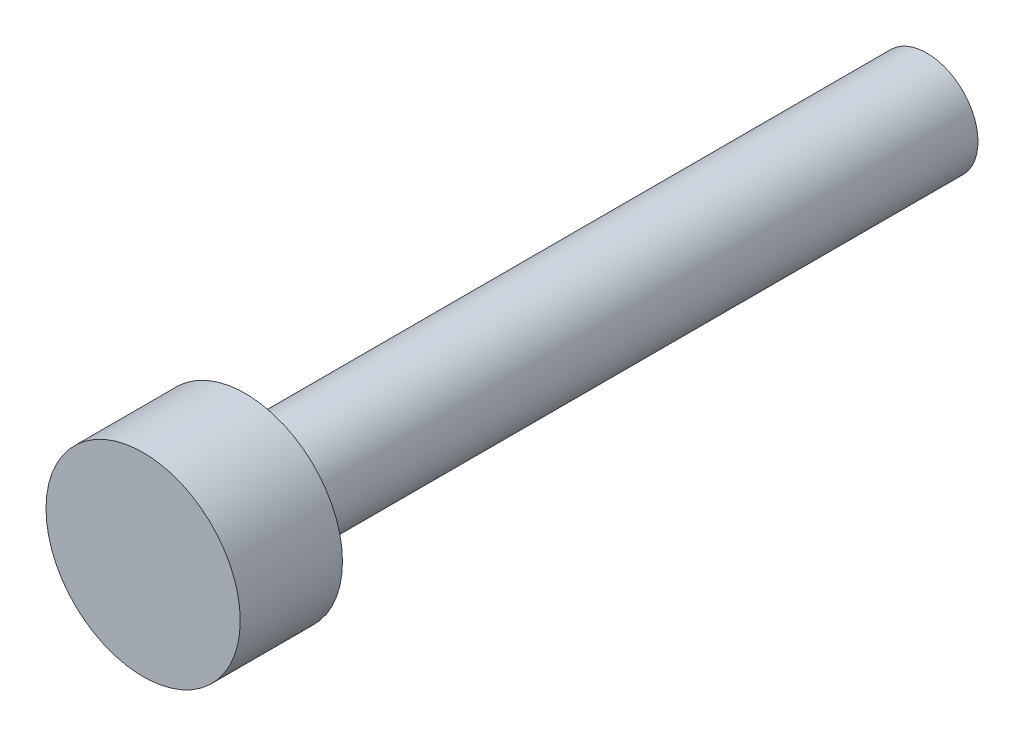
ISO-10303-21;
HEADER;
FILE_DESCRIPTION(('STEP AP214'),'2;1');
FILE_NAME('part.step','',(''),(''),'','','');
FILE_SCHEMA(('AUTOMOTIVE_DESIGN { 1 0 10303 214 1 1 1 1 }'));
ENDSEC;
DATA;
#1=APPLICATION_CONTEXT('core data for automotive mechanical design processes');
#2=APPLICATION_PROTOCOL_DEFINITION('international standard','automotive_design',2000,#1);
#3=PRODUCT_CONTEXT('',#1,'mechanical');
#4=PRODUCT('Part','Part','',(#3));
#5=PRODUCT_RELATED_PRODUCT_CATEGORY('part','',(#4));
#6=PRODUCT_DEFINITION_FORMATION('','',#4);
#7=PRODUCT_DEFINITION_CONTEXT('part definition',#1,'design');
#8=PRODUCT_DEFINITION('design','',#6,#7);
#9=PRODUCT_DEFINITION_SHAPE('','',#8);
#10=(LENGTH_UNIT() NAMED_UNIT(*) SI_UNIT(.MILLI.,.METRE.));
#11=(NAMED_UNIT(*) PLANE_ANGLE_UNIT() SI_UNIT($,.RADIAN.));
#12=(NAMED_UNIT(*) SI_UNIT($,.STERADIAN.) SOLID_ANGLE_UNIT());
#13=UNCERTAINTY_MEASURE_WITH_UNIT(LENGTH_MEASURE(1.E-05),#10,'distance_accuracy_value','');
#14=(GEOMETRIC_REPRESENTATION_CONTEXT(3) GLOBAL_UNCERTAINTY_ASSIGNED_CONTEXT((#13)) GLOBAL_UNIT_ASSIGNED_CONTEXT((#10,
#11,#12)) REPRESENTATION_CONTEXT('',''));
#15=CARTESIAN_POINT('',(0.,0.,0.));
#16=DIRECTION('',(0.,0.,1.));
#17=DIRECTION('',(1.,0.,0.));
#18=AXIS2_PLACEMENT_3D('',#15,#16,#17);
#19=CARTESIAN_POINT('',(0.,0.,20.));
#20=DIRECTION('',(0.,0.,-1.));
#21=DIRECTION('',(-1.,0.,0.));
#22=AXIS2_PLACEMENT_3D('',#19,#20,#21);
#23=CYLINDRICAL_SURFACE('',#22,1.5);
#24=CARTESIAN_POINT('',(0.,0.,20.));
#25=DIRECTION('',(0.,0.,1.));
#26=DIRECTION('',(1.,0.,0.));
#27=AXIS2_PLACEMENT_3D('',#24,#25,#26);
#28=CIRCLE('',#27,1.5);
#29=CARTESIAN_POINT('',(1.5,0.,20.));
#30=VERTEX_POINT('',#29);
#31=EDGE_CURVE('E10',#30,#30,#28,.T.);
#32=ORIENTED_EDGE('',*,*,#31,.F.);
#33=EDGE_LOOP('',(#32));
#34=FACE_BOUND('',#33,.T.);
#35=CARTESIAN_POINT('',(0.,0.,0.));
#36=DIRECTION('',(0.,0.,1.));
#37=DIRECTION('',(1.,0.,0.));
#38=AXIS2_PLACEMENT_3D('',#35,#36,#37);
#39=CIRCLE('',#38,1.5);
#40=CARTESIAN_POINT('',(1.5,0.,0.));
#41=VERTEX_POINT('',#40);
#42=EDGE_CURVE('E38',#41,#41,#39,.T.);
#43=ORIENTED_EDGE('',*,*,#42,.T.);
#44=EDGE_LOOP('',(#43));
#45=FACE_BOUND('',#44,.T.);
#46=ADVANCED_FACE('F35',(#34,#45),#23,.T.);
#47=CARTESIAN_POINT('',(0.,0.,0.));
#48=DIRECTION('',(0.,0.,1.));
#49=DIRECTION('',(1.,0.,0.));
#50=AXIS2_PLACEMENT_3D('',#47,#48,#49);
#51=PLANE('',#50);
#52=ORIENTED_EDGE('',*,*,#42,.F.);
#53=EDGE_LOOP('',(#52));
#54=FACE_BOUND('',#53,.T.);
#55=ADVANCED_FACE('F58',(#54),#51,.F.);
#56=CARTESIAN_POINT('',(0.,0.,23.));
#57=DIRECTION('',(0.,0.,-1.));
#58=DIRECTION('',(-1.,0.,0.));
#59=AXIS2_PLACEMENT_3D('',#56,#57,#58);
#60=CYLINDRICAL_SURFACE('',#59,2.85);
#61=CARTESIAN_POINT('',(0.,0.,23.));
#62=DIRECTION('',(0.,0.,1.));
#63=DIRECTION('',(1.,0.,0.));
#64=AXIS2_PLACEMENT_3D('',#61,#62,#63);
#65=CIRCLE('',#64,2.85);
#66=CARTESIAN_POINT('',(2.85,0.,23.));
#67=VERTEX_POINT('',#66);
#68=EDGE_CURVE('E45',#67,#67,#65,.T.);
#69=ORIENTED_EDGE('',*,*,#68,.F.);
#70=EDGE_LOOP('',(#69));
#71=FACE_BOUND('',#70,.T.);
#72=CARTESIAN_POINT('',(0.,0.,20.));
#73=DIRECTION('',(0.,0.,1.));
#74=DIRECTION('',(1.,0.,0.));
#75=AXIS2_PLACEMENT_3D('',#72,#73,#74);
#76=CIRCLE('',#75,2.85);
#77=CARTESIAN_POINT('',(2.85,0.,20.));
#78=VERTEX_POINT('',#77);
#79=EDGE_CURVE('E47',#78,#78,#76,.T.);
#80=ORIENTED_EDGE('',*,*,#79,.T.);
#81=EDGE_LOOP('',(#80));
#82=FACE_BOUND('',#81,.T.);
#83=ADVANCED_FACE('F55',(#71,#82),#60,.T.);
#84=CARTESIAN_POINT('',(0.,0.,23.));
#85=DIRECTION('',(0.,0.,1.));
#86=DIRECTION('',(1.,0.,0.));
#87=AXIS2_PLACEMENT_3D('',#84,#85,#86);
#88=PLANE('',#87);
#89=ORIENTED_EDGE('',*,*,#68,.T.);
#90=EDGE_LOOP('',(#89));
#91=FACE_BOUND('',#90,.T.);
#92=ADVANCED_FACE('F53',(#91),#88,.T.);
#93=CARTESIAN_POINT('',(0.,0.,20.));
#94=DIRECTION('',(0.,0.,1.));
#95=DIRECTION('',(1.,0.,0.));
#96=AXIS2_PLACEMENT_3D('',#93,#94,#95);
#97=PLANE('',#96);
#98=ORIENTED_EDGE('',*,*,#31,.T.);
#99=EDGE_LOOP('',(#98));
#100=FACE_BOUND('',#99,.T.);
#101=ORIENTED_EDGE('',*,*,#79,.F.);
#102=EDGE_LOOP('',(#101));
#103=FACE_BOUND('',#102,.T.);
#104=ADVANCED_FACE('F62',(#100,#103),#97,.F.);
#105=CLOSED_SHELL('',(#46,#55,#83,#92,#104));
#106=MANIFOLD_SOLID_BREP('B2',#105);
#107=ADVANCED_BREP_SHAPE_REPRESENTATION('',(#18,#106),#14);
#108=SHAPE_DEFINITION_REPRESENTATION(#9,#107);
ENDSEC;
END-ISO-10303-21;
